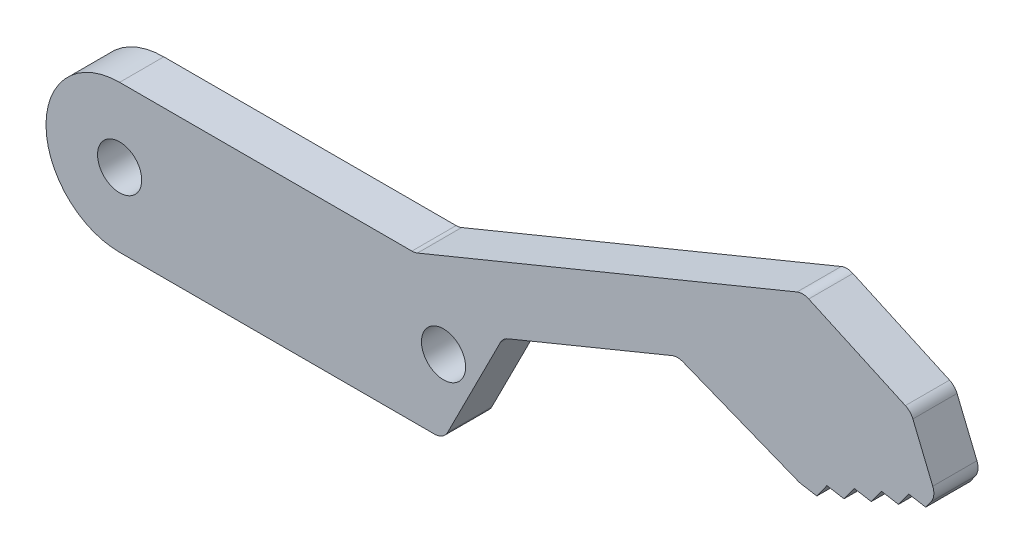
ISO-10303-21;
HEADER;
FILE_DESCRIPTION(('STEP AP214'),'2;1');
FILE_NAME('part.step','',(''),(''),'','','');
FILE_SCHEMA(('AUTOMOTIVE_DESIGN { 1 0 10303 214 1 1 1 1 }'));
ENDSEC;
DATA;
#1=APPLICATION_CONTEXT('core data for automotive mechanical design processes');
#2=APPLICATION_PROTOCOL_DEFINITION('international standard','automotive_design',2000,#1);
#3=PRODUCT_CONTEXT('',#1,'mechanical');
#4=PRODUCT('Part','Part','',(#3));
#5=PRODUCT_RELATED_PRODUCT_CATEGORY('part','',(#4));
#6=PRODUCT_DEFINITION_FORMATION('','',#4);
#7=PRODUCT_DEFINITION_CONTEXT('part definition',#1,'design');
#8=PRODUCT_DEFINITION('design','',#6,#7);
#9=PRODUCT_DEFINITION_SHAPE('','',#8);
#10=(LENGTH_UNIT() NAMED_UNIT(*) SI_UNIT(.MILLI.,.METRE.));
#11=(NAMED_UNIT(*) PLANE_ANGLE_UNIT() SI_UNIT($,.RADIAN.));
#12=(NAMED_UNIT(*) SI_UNIT($,.STERADIAN.) SOLID_ANGLE_UNIT());
#13=UNCERTAINTY_MEASURE_WITH_UNIT(LENGTH_MEASURE(1.E-05),#10,'distance_accuracy_value','');
#14=(GEOMETRIC_REPRESENTATION_CONTEXT(3) GLOBAL_UNCERTAINTY_ASSIGNED_CONTEXT((#13)) GLOBAL_UNIT_ASSIGNED_CONTEXT((#10,
#11,#12)) REPRESENTATION_CONTEXT('',''));
#15=CARTESIAN_POINT('',(0.,0.,0.));
#16=DIRECTION('',(0.,0.,1.));
#17=DIRECTION('',(1.,0.,0.));
#18=AXIS2_PLACEMENT_3D('',#15,#16,#17);
#19=CARTESIAN_POINT('',(-23.4985969391951,21.7748727167963,-4.8));
#20=DIRECTION('',(-0.167721751487341,-0.985834374567056,0.));
#21=DIRECTION('',(0.985834374567056,-0.167721751487341,0.));
#22=AXIS2_PLACEMENT_3D('',#19,#20,#21);
#23=PLANE('',#22);
#24=DIRECTION('',(0.985834374567056,-0.167721751487341,0.));
#25=VECTOR('',#24,1.);
#26=CARTESIAN_POINT('',(-23.4985969391951,21.7748727167963,1.8));
#27=LINE('',#26,#25);
#28=CARTESIAN_POINT('',(73.8339701157959,5.21551036914899,1.8));
#29=VERTEX_POINT('',#28);
#30=CARTESIAN_POINT('',(76.1637136117617,4.81914697409976,1.8));
#31=VERTEX_POINT('',#30);
#32=EDGE_CURVE('E299',#29,#31,#27,.T.);
#33=ORIENTED_EDGE('',*,*,#32,.F.);
#34=DIRECTION('',(0.,0.,1.));
#35=VECTOR('',#34,1.);
#36=CARTESIAN_POINT('',(73.8339701157959,5.21551036914899,-4.8));
#37=LINE('',#36,#35);
#38=CARTESIAN_POINT('',(73.8339701157959,5.21551036914899,-4.8));
#39=VERTEX_POINT('',#38);
#40=EDGE_CURVE('E225',#29,#39,#37,.F.);
#41=ORIENTED_EDGE('',*,*,#40,.T.);
#42=DIRECTION('',(0.985834374567056,-0.167721751487341,0.));
#43=VECTOR('',#42,1.);
#44=CARTESIAN_POINT('',(-23.4985969391951,21.7748727167963,-4.8));
#45=LINE('',#44,#43);
#46=CARTESIAN_POINT('',(76.1637136117617,4.81914697409976,-4.8));
#47=VERTEX_POINT('',#46);
#48=EDGE_CURVE('E219',#39,#47,#45,.T.);
#49=ORIENTED_EDGE('',*,*,#48,.T.);
#50=DIRECTION('',(0.,0.,1.));
#51=VECTOR('',#50,1.);
#52=CARTESIAN_POINT('',(76.1637136117617,4.81914697409976,-4.8));
#53=LINE('',#52,#51);
#54=EDGE_CURVE('E222',#47,#31,#53,.T.);
#55=ORIENTED_EDGE('',*,*,#54,.T.);
#56=EDGE_LOOP('',(#33,#41,#49,#55));
#57=FACE_BOUND('',#56,.T.);
#58=ADVANCED_FACE('F38',(#57),#23,.T.);
#59=CARTESIAN_POINT('',(-10.7524309757496,38.7393741326401,-4.8));
#60=DIRECTION('',(0.368935795459583,0.929454882621316,0.));
#61=DIRECTION('',(-0.929454882621316,0.368935795459583,0.));
#62=AXIS2_PLACEMENT_3D('',#59,#60,#61);
#63=PLANE('',#62);
#64=DIRECTION('',(-0.929454882621316,0.368935795459583,0.));
#65=VECTOR('',#64,1.);
#66=CARTESIAN_POINT('',(-10.7524309757496,38.7393741326401,-4.8));
#67=LINE('',#66,#65);
#68=CARTESIAN_POINT('',(73.3912992190569,5.33954525142962,-4.8));
#69=VERTEX_POINT('',#68);
#70=CARTESIAN_POINT('',(56.1655451294501,12.1770985380581,-4.8));
#71=VERTEX_POINT('',#70);
#72=EDGE_CURVE('E291',#69,#71,#67,.T.);
#73=ORIENTED_EDGE('',*,*,#72,.F.);
#74=DIRECTION('',(0.,0.,1.));
#75=VECTOR('',#74,1.);
#76=CARTESIAN_POINT('',(73.3912992190569,5.33954525142961,1.8));
#77=LINE('',#76,#75);
#78=CARTESIAN_POINT('',(73.3912992190569,5.33954525142962,1.8));
#79=VERTEX_POINT('',#78);
#80=EDGE_CURVE('E378',#69,#79,#77,.T.);
#81=ORIENTED_EDGE('',*,*,#80,.T.);
#82=DIRECTION('',(-0.929454882621316,0.368935795459583,0.));
#83=VECTOR('',#82,1.);
#84=CARTESIAN_POINT('',(-10.7524309757496,38.7393741326401,1.8));
#85=LINE('',#84,#83);
#86=CARTESIAN_POINT('',(56.1655451294501,12.1770985380581,1.8));
#87=VERTEX_POINT('',#86);
#88=EDGE_CURVE('E349',#79,#87,#85,.T.);
#89=ORIENTED_EDGE('',*,*,#88,.T.);
#90=DIRECTION('',(0.,0.,1.));
#91=VECTOR('',#90,1.);
#92=CARTESIAN_POINT('',(56.1655451294501,12.1770985380581,-4.8));
#93=LINE('',#92,#91);
#94=EDGE_CURVE('E359',#87,#71,#93,.F.);
#95=ORIENTED_EDGE('',*,*,#94,.T.);
#96=EDGE_LOOP('',(#73,#81,#89,#95));
#97=FACE_BOUND('',#96,.T.);
#98=ADVANCED_FACE('F536',(#97),#63,.F.);
#99=CARTESIAN_POINT('',(-22.0192492710195,-19.3009527520292,-4.8));
#100=DIRECTION('',(-0.380263412733206,0.924878228166549,0.));
#101=DIRECTION('',(-0.924878228166549,-0.380263412733206,0.));
#102=AXIS2_PLACEMENT_3D('',#99,#100,#101);
#103=PLANE('',#102);
#104=DIRECTION('',(-0.924878228166549,-0.380263412733206,0.));
#105=VECTOR('',#104,1.);
#106=CARTESIAN_POINT('',(-22.0192492710195,-19.3009527520292,-4.8));
#107=LINE('',#106,#105);
#108=CARTESIAN_POINT('',(54.517306871426,12.1670298982576,-4.8));
#109=VERTEX_POINT('',#108);
#110=CARTESIAN_POINT('',(30.0119702472426,2.09166791967512,-4.8));
#111=VERTEX_POINT('',#110);
#112=EDGE_CURVE('E288',#109,#111,#107,.T.);
#113=ORIENTED_EDGE('',*,*,#112,.F.);
#114=DIRECTION('',(0.,0.,1.));
#115=VECTOR('',#114,1.);
#116=CARTESIAN_POINT('',(54.517306871426,12.1670298982576,1.8));
#117=LINE('',#116,#115);
#118=CARTESIAN_POINT('',(54.517306871426,12.1670298982576,1.8));
#119=VERTEX_POINT('',#118);
#120=EDGE_CURVE('E422',#109,#119,#117,.T.);
#121=ORIENTED_EDGE('',*,*,#120,.T.);
#122=DIRECTION('',(-0.924878228166549,-0.380263412733206,0.));
#123=VECTOR('',#122,1.);
#124=CARTESIAN_POINT('',(-22.0192492710195,-19.3009527520292,1.8));
#125=LINE('',#124,#123);
#126=CARTESIAN_POINT('',(30.0119702472426,2.09166791967512,1.8));
#127=VERTEX_POINT('',#126);
#128=EDGE_CURVE('E346',#119,#127,#125,.T.);
#129=ORIENTED_EDGE('',*,*,#128,.T.);
#130=DIRECTION('',(0.,0.,1.));
#131=VECTOR('',#130,1.);
#132=CARTESIAN_POINT('',(30.0119702472426,2.09166791967511,-4.8));
#133=LINE('',#132,#131);
#134=EDGE_CURVE('E420',#127,#111,#133,.F.);
#135=ORIENTED_EDGE('',*,*,#134,.T.);
#136=EDGE_LOOP('',(#113,#121,#129,#135));
#137=FACE_BOUND('',#136,.T.);
#138=ADVANCED_FACE('F451',(#137),#103,.F.);
#139=CARTESIAN_POINT('',(14.9545934591534,-26.4767169371908,-4.8));
#140=DIRECTION('',(-0.892245156425912,0.451551304764474,0.));
#141=DIRECTION('',(-0.451551304764474,-0.892245156425912,0.));
#142=AXIS2_PLACEMENT_3D('',#139,#140,#141);
#143=PLANE('',#142);
#144=DIRECTION('',(-0.451551304764474,-0.892245156425912,0.));
#145=VECTOR('',#144,1.);
#146=CARTESIAN_POINT('',(14.9545934591534,-26.4767169371908,-4.8));
#147=LINE('',#146,#145);
#148=CARTESIAN_POINT('',(28.8856104111187,1.05034868819055,-4.8));
#149=VERTEX_POINT('',#148);
#150=CARTESIAN_POINT('',(21.0020805174896,-14.5271533340842,-4.8));
#151=VERTEX_POINT('',#150);
#152=EDGE_CURVE('E285',#149,#151,#147,.T.);
#153=ORIENTED_EDGE('',*,*,#152,.F.);
#154=DIRECTION('',(0.,0.,1.));
#155=VECTOR('',#154,1.);
#156=CARTESIAN_POINT('',(28.8856104111187,1.05034868819055,1.8));
#157=LINE('',#156,#155);
#158=CARTESIAN_POINT('',(28.8856104111187,1.05034868819055,1.8));
#159=VERTEX_POINT('',#158);
#160=EDGE_CURVE('E427',#149,#159,#157,.T.);
#161=ORIENTED_EDGE('',*,*,#160,.T.);
#162=DIRECTION('',(-0.451551304764474,-0.892245156425912,0.));
#163=VECTOR('',#162,1.);
#164=CARTESIAN_POINT('',(14.9545934591534,-26.4767169371908,1.8));
#165=LINE('',#164,#163);
#166=CARTESIAN_POINT('',(21.0020805174896,-14.5271533340842,1.8));
#167=VERTEX_POINT('',#166);
#168=EDGE_CURVE('E343',#159,#167,#165,.T.);
#169=ORIENTED_EDGE('',*,*,#168,.T.);
#170=DIRECTION('',(0.,0.,1.));
#171=VECTOR('',#170,1.);
#172=CARTESIAN_POINT('',(21.0020805174896,-14.5271533340842,-4.8));
#173=LINE('',#172,#171);
#174=EDGE_CURVE('E425',#167,#151,#173,.F.);
#175=ORIENTED_EDGE('',*,*,#174,.T.);
#176=EDGE_LOOP('',(#153,#161,#169,#175));
#177=FACE_BOUND('',#176,.T.);
#178=ADVANCED_FACE('F458',(#177),#143,.F.);
#179=CARTESIAN_POINT('',(-28.0085543385497,-15.7337404636024,-4.8));
#180=DIRECTION('',(0.,-1.,0.));
#181=DIRECTION('',(1.,0.,0.));
#182=AXIS2_PLACEMENT_3D('',#179,#180,#181);
#183=PLANE('',#182);
#184=DIRECTION('',(1.,0.,0.));
#185=VECTOR('',#184,1.);
#186=CARTESIAN_POINT('',(-28.0085543385497,-15.7337404636024,-4.8));
#187=LINE('',#186,#185);
#188=CARTESIAN_POINT('',(-28.0085543385497,-15.7337404636024,-4.8));
#189=VERTEX_POINT('',#188);
#190=CARTESIAN_POINT('',(19.0391411733526,-15.7337404636024,-4.8));
#191=VERTEX_POINT('',#190);
#192=EDGE_CURVE('E282',#189,#191,#187,.T.);
#193=ORIENTED_EDGE('',*,*,#192,.T.);
#194=DIRECTION('',(0.,0.,1.));
#195=VECTOR('',#194,1.);
#196=CARTESIAN_POINT('',(19.0391411733526,-15.7337404636024,1.8));
#197=LINE('',#196,#195);
#198=CARTESIAN_POINT('',(19.0391411733526,-15.7337404636024,1.8));
#199=VERTEX_POINT('',#198);
#200=EDGE_CURVE('E430',#191,#199,#197,.T.);
#201=ORIENTED_EDGE('',*,*,#200,.T.);
#202=DIRECTION('',(1.,0.,0.));
#203=VECTOR('',#202,1.);
#204=CARTESIAN_POINT('',(-28.0085543385497,-15.7337404636024,1.8));
#205=LINE('',#204,#203);
#206=CARTESIAN_POINT('',(-28.0085543385497,-15.7337404636024,1.8));
#207=VERTEX_POINT('',#206);
#208=EDGE_CURVE('E340',#207,#199,#205,.T.);
#209=ORIENTED_EDGE('',*,*,#208,.F.);
#210=DIRECTION('',(0.,0.,1.));
#211=VECTOR('',#210,1.);
#212=CARTESIAN_POINT('',(-28.0085543385497,-15.7337404636024,-4.8));
#213=LINE('',#212,#211);
#214=EDGE_CURVE('E357',#189,#207,#213,.T.);
#215=ORIENTED_EDGE('',*,*,#214,.F.);
#216=EDGE_LOOP('',(#193,#201,#209,#215));
#217=FACE_BOUND('',#216,.T.);
#218=ADVANCED_FACE('F465',(#217),#183,.T.);
#219=CARTESIAN_POINT('',(-28.0085543385497,-4.7337404636024,-4.8));
#220=DIRECTION('',(0.,0.,1.));
#221=DIRECTION('',(1.,0.,0.));
#222=AXIS2_PLACEMENT_3D('',#219,#220,#221);
#223=CYLINDRICAL_SURFACE('',#222,11.);
#224=CARTESIAN_POINT('',(-28.0085543385497,-4.7337404636024,1.8));
#225=DIRECTION('',(0.,0.,1.));
#226=DIRECTION('',(1.,0.,0.));
#227=AXIS2_PLACEMENT_3D('',#224,#225,#226);
#228=CIRCLE('',#227,11.);
#229=CARTESIAN_POINT('',(-28.0085543385497,6.2662595363976,1.8));
#230=VERTEX_POINT('',#229);
#231=EDGE_CURVE('E337',#230,#207,#228,.T.);
#232=ORIENTED_EDGE('',*,*,#231,.F.);
#233=DIRECTION('',(0.,0.,1.));
#234=VECTOR('',#233,1.);
#235=CARTESIAN_POINT('',(-28.0085543385497,6.2662595363976,-4.8));
#236=LINE('',#235,#234);
#237=CARTESIAN_POINT('',(-28.0085543385497,6.2662595363976,-4.8));
#238=VERTEX_POINT('',#237);
#239=EDGE_CURVE('E360',#238,#230,#236,.T.);
#240=ORIENTED_EDGE('',*,*,#239,.F.);
#241=CARTESIAN_POINT('',(-28.0085543385497,-4.7337404636024,-4.8));
#242=DIRECTION('',(0.,0.,1.));
#243=DIRECTION('',(1.,0.,0.));
#244=AXIS2_PLACEMENT_3D('',#241,#242,#243);
#245=CIRCLE('',#244,11.);
#246=EDGE_CURVE('E279',#238,#189,#245,.T.);
#247=ORIENTED_EDGE('',*,*,#246,.T.);
#248=ORIENTED_EDGE('',*,*,#214,.T.);
#249=EDGE_LOOP('',(#232,#240,#247,#248));
#250=FACE_BOUND('',#249,.T.);
#251=ADVANCED_FACE('F469',(#250),#223,.T.);
#252=CARTESIAN_POINT('',(-28.0085543385497,6.2662595363976,-4.8));
#253=DIRECTION('',(0.,-1.,0.));
#254=DIRECTION('',(1.,0.,0.));
#255=AXIS2_PLACEMENT_3D('',#252,#253,#254);
#256=PLANE('',#255);
#257=DIRECTION('',(1.,0.,0.));
#258=VECTOR('',#257,1.);
#259=CARTESIAN_POINT('',(-28.0085543385497,6.2662595363976,1.8));
#260=LINE('',#259,#258);
#261=CARTESIAN_POINT('',(15.6668314111712,6.26625953639759,1.8));
#262=VERTEX_POINT('',#261);
#263=EDGE_CURVE('E334',#230,#262,#260,.T.);
#264=ORIENTED_EDGE('',*,*,#263,.T.);
#265=DIRECTION('',(0.,0.,1.));
#266=VECTOR('',#265,1.);
#267=CARTESIAN_POINT('',(15.6668314111712,6.26625953639759,-4.8));
#268=LINE('',#267,#266);
#269=CARTESIAN_POINT('',(15.6668314111712,6.26625953639759,-4.8));
#270=VERTEX_POINT('',#269);
#271=EDGE_CURVE('E418',#262,#270,#268,.F.);
#272=ORIENTED_EDGE('',*,*,#271,.T.);
#273=DIRECTION('',(1.,0.,0.));
#274=VECTOR('',#273,1.);
#275=CARTESIAN_POINT('',(-28.0085543385497,6.2662595363976,-4.8));
#276=LINE('',#275,#274);
#277=EDGE_CURVE('E276',#238,#270,#276,.T.);
#278=ORIENTED_EDGE('',*,*,#277,.F.);
#279=ORIENTED_EDGE('',*,*,#239,.T.);
#280=EDGE_LOOP('',(#264,#272,#278,#279));
#281=FACE_BOUND('',#280,.T.);
#282=ADVANCED_FACE('F742',(#281),#256,.F.);
#283=CARTESIAN_POINT('',(-25.4989076002763,-10.8377135277866,-4.8));
#284=DIRECTION('',(0.380263412733206,-0.924878228166549,0.));
#285=DIRECTION('',(0.924878228166549,0.380263412733206,0.));
#286=AXIS2_PLACEMENT_3D('',#283,#284,#285);
#287=PLANE('',#286);
#288=DIRECTION('',(0.924878228166549,0.380263412733206,0.));
#289=VECTOR('',#288,1.);
#290=CARTESIAN_POINT('',(-25.4989076002763,-10.8377135277866,1.8));
#291=LINE('',#290,#289);
#292=CARTESIAN_POINT('',(16.5034109191842,6.43152743443118,1.8));
#293=VERTEX_POINT('',#292);
#294=CARTESIAN_POINT('',(73.209976115322,29.7464151127887,1.8));
#295=VERTEX_POINT('',#294);
#296=EDGE_CURVE('E331',#293,#295,#291,.T.);
#297=ORIENTED_EDGE('',*,*,#296,.T.);
#298=DIRECTION('',(0.,0.,1.));
#299=VECTOR('',#298,1.);
#300=CARTESIAN_POINT('',(73.209976115322,29.7464151127887,-4.8));
#301=LINE('',#300,#299);
#302=CARTESIAN_POINT('',(73.209976115322,29.7464151127887,-4.8));
#303=VERTEX_POINT('',#302);
#304=EDGE_CURVE('E416',#295,#303,#301,.F.);
#305=ORIENTED_EDGE('',*,*,#304,.T.);
#306=DIRECTION('',(0.924878228166549,0.380263412733206,0.));
#307=VECTOR('',#306,1.);
#308=CARTESIAN_POINT('',(-25.4989076002763,-10.8377135277866,-4.8));
#309=LINE('',#308,#307);
#310=CARTESIAN_POINT('',(16.5034109191842,6.43152743443118,-4.8));
#311=VERTEX_POINT('',#310);
#312=EDGE_CURVE('E273',#311,#303,#309,.T.);
#313=ORIENTED_EDGE('',*,*,#312,.F.);
#314=DIRECTION('',(0.,0.,1.));
#315=VECTOR('',#314,1.);
#316=CARTESIAN_POINT('',(16.5034109191842,6.43152743443118,1.8));
#317=LINE('',#316,#315);
#318=EDGE_CURVE('E413',#311,#293,#317,.T.);
#319=ORIENTED_EDGE('',*,*,#318,.T.);
#320=EDGE_LOOP('',(#297,#305,#313,#319));
#321=FACE_BOUND('',#320,.T.);
#322=ADVANCED_FACE('F480',(#321),#287,.F.);
#323=CARTESIAN_POINT('',(2.67882750053871,62.6371157810134,-4.8));
#324=DIRECTION('',(-0.414522259932088,-0.910039172794663,0.));
#325=DIRECTION('',(0.910039172794663,-0.414522259932088,0.));
#326=AXIS2_PLACEMENT_3D('',#323,#324,#325);
#327=PLANE('',#326);
#328=DIRECTION('',(0.910039172794663,-0.414522259932088,0.));
#329=VECTOR('',#328,1.);
#330=CARTESIAN_POINT('',(2.67882750053871,62.6371157810134,1.8));
#331=LINE('',#330,#329);
#332=CARTESIAN_POINT('',(74.9585045951857,29.7137691909705,1.8));
#333=VERTEX_POINT('',#332);
#334=CARTESIAN_POINT('',(89.3969433906142,23.1370695737524,1.8));
#335=VERTEX_POINT('',#334);
#336=EDGE_CURVE('E328',#333,#335,#331,.T.);
#337=ORIENTED_EDGE('',*,*,#336,.T.);
#338=DIRECTION('',(0.,0.,1.));
#339=VECTOR('',#338,1.);
#340=CARTESIAN_POINT('',(89.3969433906142,23.1370695737524,-4.8));
#341=LINE('',#340,#339);
#342=CARTESIAN_POINT('',(89.3969433906142,23.1370695737524,-4.8));
#343=VERTEX_POINT('',#342);
#344=EDGE_CURVE('E411',#335,#343,#341,.F.);
#345=ORIENTED_EDGE('',*,*,#344,.T.);
#346=DIRECTION('',(0.910039172794663,-0.414522259932088,0.));
#347=VECTOR('',#346,1.);
#348=CARTESIAN_POINT('',(2.67882750053871,62.6371157810134,-4.8));
#349=LINE('',#348,#347);
#350=CARTESIAN_POINT('',(74.9585045951857,29.7137691909705,-4.8));
#351=VERTEX_POINT('',#350);
#352=EDGE_CURVE('E270',#351,#343,#349,.T.);
#353=ORIENTED_EDGE('',*,*,#352,.F.);
#354=DIRECTION('',(0.,0.,1.));
#355=VECTOR('',#354,1.);
#356=CARTESIAN_POINT('',(74.9585045951857,29.7137691909705,-4.8));
#357=LINE('',#356,#355);
#358=EDGE_CURVE('E408',#351,#333,#357,.T.);
#359=ORIENTED_EDGE('',*,*,#358,.T.);
#360=EDGE_LOOP('',(#337,#345,#353,#359));
#361=FACE_BOUND('',#360,.T.);
#362=ADVANCED_FACE('F490',(#361),#327,.F.);
#363=CARTESIAN_POINT('',(82.7726903900345,40.8139358730261,-4.8));
#364=DIRECTION('',(-0.924878228166548,-0.38026341273321,0.));
#365=DIRECTION('',(0.38026341273321,-0.924878228166548,0.));
#366=AXIS2_PLACEMENT_3D('',#363,#364,#365);
#367=PLANE('',#366);
#368=DIRECTION('',(0.38026341273321,-0.924878228166548,0.));
#369=VECTOR('',#368,1.);
#370=CARTESIAN_POINT('',(82.7726903900345,40.8139358730261,1.8));
#371=LINE('',#370,#369);
#372=CARTESIAN_POINT('',(90.51972652073,21.9715629016172,1.8));
#373=VERTEX_POINT('',#372);
#374=CARTESIAN_POINT('',(93.4897681177018,14.7478155785599,1.8));
#375=VERTEX_POINT('',#374);
#376=EDGE_CURVE('E326',#373,#375,#371,.T.);
#377=ORIENTED_EDGE('',*,*,#376,.T.);
#378=DIRECTION('',(0.,0.,1.));
#379=VECTOR('',#378,1.);
#380=CARTESIAN_POINT('',(93.4897681177018,14.7478155785599,-4.8));
#381=LINE('',#380,#379);
#382=CARTESIAN_POINT('',(93.4897681177018,14.7478155785599,-4.8));
#383=VERTEX_POINT('',#382);
#384=EDGE_CURVE('E61',#375,#383,#381,.F.);
#385=ORIENTED_EDGE('',*,*,#384,.T.);
#386=DIRECTION('',(0.38026341273321,-0.924878228166548,0.));
#387=VECTOR('',#386,1.);
#388=CARTESIAN_POINT('',(82.7726903900345,40.8139358730261,-4.8));
#389=LINE('',#388,#387);
#390=CARTESIAN_POINT('',(90.51972652073,21.9715629016172,-4.8));
#391=VERTEX_POINT('',#390);
#392=EDGE_CURVE('E268',#391,#383,#389,.T.);
#393=ORIENTED_EDGE('',*,*,#392,.F.);
#394=DIRECTION('',(0.,0.,1.));
#395=VECTOR('',#394,1.);
#396=CARTESIAN_POINT('',(90.51972652073,21.9715629016172,-4.8));
#397=LINE('',#396,#395);
#398=EDGE_CURVE('E404',#391,#373,#397,.T.);
#399=ORIENTED_EDGE('',*,*,#398,.T.);
#400=EDGE_LOOP('',(#377,#385,#393,#399));
#401=FACE_BOUND('',#400,.T.);
#402=ADVANCED_FACE('F497',(#401),#367,.F.);
#403=CARTESIAN_POINT('',(43.8426905918468,-56.258856100548,-4.8));
#404=DIRECTION('',(0.812647209633221,-0.582755963225894,0.));
#405=DIRECTION('',(0.582755963225894,0.812647209633221,0.));
#406=AXIS2_PLACEMENT_3D('',#403,#404,#405);
#407=PLANE('',#406);
#408=DIRECTION('',(0.582755963225894,0.812647209633221,0.));
#409=VECTOR('',#408,1.);
#410=CARTESIAN_POINT('',(43.8426905918468,-56.258856100548,-4.8));
#411=LINE('',#410,#409);
#412=CARTESIAN_POINT('',(92.4415704274929,11.5117830382042,-4.8));
#413=VERTEX_POINT('',#412);
#414=CARTESIAN_POINT('',(93.2428598769284,12.6291729514498,-4.8));
#415=VERTEX_POINT('',#414);
#416=EDGE_CURVE('E266',#413,#415,#411,.T.);
#417=ORIENTED_EDGE('',*,*,#416,.T.);
#418=DIRECTION('',(0.,0.,1.));
#419=VECTOR('',#418,1.);
#420=CARTESIAN_POINT('',(93.2428598769284,12.6291729514498,1.8));
#421=LINE('',#420,#419);
#422=CARTESIAN_POINT('',(93.2428598769284,12.6291729514498,1.8));
#423=VERTEX_POINT('',#422);
#424=EDGE_CURVE('E401',#415,#423,#421,.T.);
#425=ORIENTED_EDGE('',*,*,#424,.T.);
#426=DIRECTION('',(0.582755963225894,0.812647209633221,0.));
#427=VECTOR('',#426,1.);
#428=CARTESIAN_POINT('',(43.8426905918468,-56.258856100548,1.8));
#429=LINE('',#428,#427);
#430=CARTESIAN_POINT('',(92.4415704274929,11.5117830382042,1.8));
#431=VERTEX_POINT('',#430);
#432=EDGE_CURVE('E323',#431,#423,#429,.T.);
#433=ORIENTED_EDGE('',*,*,#432,.F.);
#434=DIRECTION('',(0.,0.,1.));
#435=VECTOR('',#434,1.);
#436=CARTESIAN_POINT('',(92.4415704274929,11.5117830382042,-4.8));
#437=LINE('',#436,#435);
#438=EDGE_CURVE('E362',#413,#431,#437,.T.);
#439=ORIENTED_EDGE('',*,*,#438,.F.);
#440=EDGE_LOOP('',(#417,#425,#433,#439));
#441=FACE_BOUND('',#440,.T.);
#442=ADVANCED_FACE('F503',(#441),#407,.T.);
#443=CARTESIAN_POINT('',(-21.9340915703288,30.9707173710868,-4.8));
#444=DIRECTION('',(-0.167721751487341,-0.985834374567056,0.));
#445=DIRECTION('',(0.985834374567056,-0.167721751487341,0.));
#446=AXIS2_PLACEMENT_3D('',#443,#444,#445);
#447=PLANE('',#446);
#448=DIRECTION('',(0.985834374567056,-0.167721751487341,0.));
#449=VECTOR('',#448,1.);
#450=CARTESIAN_POINT('',(-21.9340915703288,30.9707173710868,1.8));
#451=LINE('',#450,#449);
#452=CARTESIAN_POINT('',(89.8839761330183,11.9469110939201,1.8));
#453=VERTEX_POINT('',#452);
#454=EDGE_CURVE('E320',#453,#431,#451,.T.);
#455=ORIENTED_EDGE('',*,*,#454,.F.);
#456=DIRECTION('',(0.,0.,1.));
#457=VECTOR('',#456,1.);
#458=CARTESIAN_POINT('',(89.8839761330183,11.9469110939201,-4.8));
#459=LINE('',#458,#457);
#460=CARTESIAN_POINT('',(89.8839761330183,11.9469110939201,-4.8));
#461=VERTEX_POINT('',#460);
#462=EDGE_CURVE('E364',#461,#453,#459,.T.);
#463=ORIENTED_EDGE('',*,*,#462,.F.);
#464=DIRECTION('',(0.985834374567056,-0.167721751487341,0.));
#465=VECTOR('',#464,1.);
#466=CARTESIAN_POINT('',(-21.9340915703288,30.9707173710868,-4.8));
#467=LINE('',#466,#465);
#468=EDGE_CURVE('E263',#461,#413,#467,.T.);
#469=ORIENTED_EDGE('',*,*,#468,.T.);
#470=ORIENTED_EDGE('',*,*,#438,.T.);
#471=EDGE_LOOP('',(#455,#463,#469,#470));
#472=FACE_BOUND('',#471,.T.);
#473=ADVANCED_FACE('F508',(#472),#447,.T.);
#474=CARTESIAN_POINT('',(41.9476010891602,-54.8998719122703,-4.8));
#475=DIRECTION('',(0.812647209633235,-0.582755963225875,0.));
#476=DIRECTION('',(0.582755963225875,0.812647209633235,0.));
#477=AXIS2_PLACEMENT_3D('',#474,#475,#476);
#478=PLANE('',#477);
#479=DIRECTION('',(0.582755963225875,0.812647209633235,0.));
#480=VECTOR('',#479,1.);
#481=CARTESIAN_POINT('',(41.9476010891602,-54.8998719122703,1.8));
#482=LINE('',#481,#480);
#483=CARTESIAN_POINT('',(88.3721062235601,9.83862402217813,1.8));
#484=VERTEX_POINT('',#483);
#485=EDGE_CURVE('E317',#484,#453,#482,.T.);
#486=ORIENTED_EDGE('',*,*,#485,.F.);
#487=DIRECTION('',(0.,0.,1.));
#488=VECTOR('',#487,1.);
#489=CARTESIAN_POINT('',(88.3721062235601,9.83862402217813,-4.8));
#490=LINE('',#489,#488);
#491=CARTESIAN_POINT('',(88.3721062235601,9.83862402217813,-4.8));
#492=VERTEX_POINT('',#491);
#493=EDGE_CURVE('E366',#492,#484,#490,.T.);
#494=ORIENTED_EDGE('',*,*,#493,.F.);
#495=DIRECTION('',(0.582755963225875,0.812647209633235,0.));
#496=VECTOR('',#495,1.);
#497=CARTESIAN_POINT('',(41.9476010891602,-54.8998719122703,-4.8));
#498=LINE('',#497,#496);
#499=EDGE_CURVE('E260',#492,#461,#498,.T.);
#500=ORIENTED_EDGE('',*,*,#499,.T.);
#501=ORIENTED_EDGE('',*,*,#462,.T.);
#502=EDGE_LOOP('',(#486,#494,#500,#501));
#503=FACE_BOUND('',#502,.T.);
#504=ADVANCED_FACE('F511',(#503),#478,.T.);
#505=CARTESIAN_POINT('',(-22.3252179125456,28.6717562075136,-4.8));
#506=DIRECTION('',(-0.167721751487335,-0.985834374567057,0.));
#507=DIRECTION('',(0.985834374567057,-0.167721751487336,0.));
#508=AXIS2_PLACEMENT_3D('',#505,#506,#507);
#509=PLANE('',#508);
#510=DIRECTION('',(0.985834374567057,-0.167721751487336,0.));
#511=VECTOR('',#510,1.);
#512=CARTESIAN_POINT('',(-22.3252179125456,28.6717562075136,1.8));
#513=LINE('',#512,#511);
#514=CARTESIAN_POINT('',(85.8145119290856,10.273752077894,1.8));
#515=VERTEX_POINT('',#514);
#516=EDGE_CURVE('E314',#515,#484,#513,.T.);
#517=ORIENTED_EDGE('',*,*,#516,.F.);
#518=DIRECTION('',(0.,0.,1.));
#519=VECTOR('',#518,1.);
#520=CARTESIAN_POINT('',(85.8145119290856,10.273752077894,-4.8));
#521=LINE('',#520,#519);
#522=CARTESIAN_POINT('',(85.8145119290856,10.273752077894,-4.8));
#523=VERTEX_POINT('',#522);
#524=EDGE_CURVE('E368',#523,#515,#521,.T.);
#525=ORIENTED_EDGE('',*,*,#524,.F.);
#526=DIRECTION('',(0.985834374567057,-0.167721751487336,0.));
#527=VECTOR('',#526,1.);
#528=CARTESIAN_POINT('',(-22.3252179125456,28.6717562075136,-4.8));
#529=LINE('',#528,#527);
#530=EDGE_CURVE('E257',#523,#492,#529,.T.);
#531=ORIENTED_EDGE('',*,*,#530,.T.);
#532=ORIENTED_EDGE('',*,*,#493,.T.);
#533=EDGE_LOOP('',(#517,#525,#531,#532));
#534=FACE_BOUND('',#533,.T.);
#535=ADVANCED_FACE('F516',(#534),#509,.T.);
#536=CARTESIAN_POINT('',(40.0525115864701,-53.5408877239934,-4.8));
#537=DIRECTION('',(0.812647209633232,-0.582755963225879,0.));
#538=DIRECTION('',(0.582755963225879,0.812647209633232,0.));
#539=AXIS2_PLACEMENT_3D('',#536,#537,#538);
#540=PLANE('',#539);
#541=DIRECTION('',(0.582755963225879,0.812647209633232,0.));
#542=VECTOR('',#541,1.);
#543=CARTESIAN_POINT('',(40.0525115864701,-53.5408877239934,1.8));
#544=LINE('',#543,#542);
#545=CARTESIAN_POINT('',(84.3026420196273,8.16546500615194,1.8));
#546=VERTEX_POINT('',#545);
#547=EDGE_CURVE('E311',#546,#515,#544,.T.);
#548=ORIENTED_EDGE('',*,*,#547,.F.);
#549=DIRECTION('',(0.,0.,1.));
#550=VECTOR('',#549,1.);
#551=CARTESIAN_POINT('',(84.3026420196273,8.16546500615194,-4.8));
#552=LINE('',#551,#550);
#553=CARTESIAN_POINT('',(84.3026420196273,8.16546500615194,-4.8));
#554=VERTEX_POINT('',#553);
#555=EDGE_CURVE('E370',#554,#546,#552,.T.);
#556=ORIENTED_EDGE('',*,*,#555,.F.);
#557=DIRECTION('',(0.582755963225879,0.812647209633232,0.));
#558=VECTOR('',#557,1.);
#559=CARTESIAN_POINT('',(40.0525115864701,-53.5408877239934,-4.8));
#560=LINE('',#559,#558);
#561=EDGE_CURVE('E254',#554,#523,#560,.T.);
#562=ORIENTED_EDGE('',*,*,#561,.T.);
#563=ORIENTED_EDGE('',*,*,#524,.T.);
#564=EDGE_LOOP('',(#548,#556,#562,#563));
#565=FACE_BOUND('',#564,.T.);
#566=ADVANCED_FACE('F519',(#565),#540,.T.);
#567=CARTESIAN_POINT('',(-22.7163442547615,26.3727950439424,-4.8));
#568=DIRECTION('',(-0.16772175148735,-0.985834374567054,0.));
#569=DIRECTION('',(0.985834374567055,-0.16772175148735,0.));
#570=AXIS2_PLACEMENT_3D('',#567,#568,#569);
#571=PLANE('',#570);
#572=DIRECTION('',(0.985834374567055,-0.16772175148735,0.));
#573=VECTOR('',#572,1.);
#574=CARTESIAN_POINT('',(-22.7163442547615,26.3727950439424,1.8));
#575=LINE('',#574,#573);
#576=CARTESIAN_POINT('',(81.7450477251527,8.6005930618679,1.8));
#577=VERTEX_POINT('',#576);
#578=EDGE_CURVE('E308',#577,#546,#575,.T.);
#579=ORIENTED_EDGE('',*,*,#578,.F.);
#580=DIRECTION('',(0.,0.,1.));
#581=VECTOR('',#580,1.);
#582=CARTESIAN_POINT('',(81.7450477251527,8.6005930618679,-4.8));
#583=LINE('',#582,#581);
#584=CARTESIAN_POINT('',(81.7450477251527,8.6005930618679,-4.8));
#585=VERTEX_POINT('',#584);
#586=EDGE_CURVE('E372',#585,#577,#583,.T.);
#587=ORIENTED_EDGE('',*,*,#586,.F.);
#588=DIRECTION('',(0.985834374567055,-0.16772175148735,0.));
#589=VECTOR('',#588,1.);
#590=CARTESIAN_POINT('',(-22.7163442547615,26.3727950439424,-4.8));
#591=LINE('',#590,#589);
#592=EDGE_CURVE('E251',#585,#554,#591,.T.);
#593=ORIENTED_EDGE('',*,*,#592,.T.);
#594=ORIENTED_EDGE('',*,*,#555,.T.);
#595=EDGE_LOOP('',(#579,#587,#593,#594));
#596=FACE_BOUND('',#595,.T.);
#597=ADVANCED_FACE('F523',(#596),#571,.T.);
#598=CARTESIAN_POINT('',(38.1574220837817,-52.1819035357161,-4.8));
#599=DIRECTION('',(0.812647209633238,-0.582755963225871,0.));
#600=DIRECTION('',(0.582755963225871,0.812647209633238,0.));
#601=AXIS2_PLACEMENT_3D('',#598,#599,#600);
#602=PLANE('',#601);
#603=DIRECTION('',(0.582755963225871,0.812647209633238,0.));
#604=VECTOR('',#603,1.);
#605=CARTESIAN_POINT('',(38.1574220837817,-52.1819035357161,1.8));
#606=LINE('',#605,#604);
#607=CARTESIAN_POINT('',(80.2331778156945,6.49230599012585,1.8));
#608=VERTEX_POINT('',#607);
#609=EDGE_CURVE('E305',#608,#577,#606,.T.);
#610=ORIENTED_EDGE('',*,*,#609,.F.);
#611=DIRECTION('',(0.,0.,1.));
#612=VECTOR('',#611,1.);
#613=CARTESIAN_POINT('',(80.2331778156945,6.49230599012585,-4.8));
#614=LINE('',#613,#612);
#615=CARTESIAN_POINT('',(80.2331778156945,6.49230599012585,-4.8));
#616=VERTEX_POINT('',#615);
#617=EDGE_CURVE('E374',#616,#608,#614,.T.);
#618=ORIENTED_EDGE('',*,*,#617,.F.);
#619=DIRECTION('',(0.582755963225871,0.812647209633238,0.));
#620=VECTOR('',#619,1.);
#621=CARTESIAN_POINT('',(38.1574220837817,-52.1819035357161,-4.8));
#622=LINE('',#621,#620);
#623=EDGE_CURVE('E246',#616,#585,#622,.T.);
#624=ORIENTED_EDGE('',*,*,#623,.T.);
#625=ORIENTED_EDGE('',*,*,#586,.T.);
#626=EDGE_LOOP('',(#610,#618,#624,#625));
#627=FACE_BOUND('',#626,.T.);
#628=ADVANCED_FACE('F526',(#627),#602,.T.);
#629=CARTESIAN_POINT('',(-23.1074705969782,24.0738338803695,-4.8));
#630=DIRECTION('',(-0.167721751487347,-0.985834374567055,0.));
#631=DIRECTION('',(0.985834374567055,-0.167721751487347,0.));
#632=AXIS2_PLACEMENT_3D('',#629,#630,#631);
#633=PLANE('',#632);
#634=DIRECTION('',(0.985834374567055,-0.167721751487347,0.));
#635=VECTOR('',#634,1.);
#636=CARTESIAN_POINT('',(-23.1074705969782,24.0738338803695,1.8));
#637=LINE('',#636,#635);
#638=CARTESIAN_POINT('',(77.6755835212199,6.92743404584181,1.8));
#639=VERTEX_POINT('',#638);
#640=EDGE_CURVE('E302',#639,#608,#637,.T.);
#641=ORIENTED_EDGE('',*,*,#640,.F.);
#642=DIRECTION('',(0.,0.,1.));
#643=VECTOR('',#642,1.);
#644=CARTESIAN_POINT('',(77.6755835212199,6.92743404584181,-4.8));
#645=LINE('',#644,#643);
#646=CARTESIAN_POINT('',(77.6755835212199,6.92743404584181,-4.8));
#647=VERTEX_POINT('',#646);
#648=EDGE_CURVE('E236',#647,#639,#645,.T.);
#649=ORIENTED_EDGE('',*,*,#648,.F.);
#650=DIRECTION('',(0.985834374567055,-0.167721751487347,0.));
#651=VECTOR('',#650,1.);
#652=CARTESIAN_POINT('',(-23.1074705969782,24.0738338803695,-4.8));
#653=LINE('',#652,#651);
#654=EDGE_CURVE('E244',#647,#616,#653,.T.);
#655=ORIENTED_EDGE('',*,*,#654,.T.);
#656=ORIENTED_EDGE('',*,*,#617,.T.);
#657=EDGE_LOOP('',(#641,#649,#655,#656));
#658=FACE_BOUND('',#657,.T.);
#659=ADVANCED_FACE('F529',(#658),#633,.T.);
#660=CARTESIAN_POINT('',(20.3914456614503,-4.73374046360239,-4.8));
#661=DIRECTION('',(0.,0.,1.));
#662=DIRECTION('',(1.,0.,0.));
#663=AXIS2_PLACEMENT_3D('',#660,#661,#662);
#664=CYLINDRICAL_SURFACE('',#663,3.30000000000001);
#665=CARTESIAN_POINT('',(20.3914456614503,-4.73374046360239,-4.8));
#666=DIRECTION('',(0.,0.,1.));
#667=DIRECTION('',(1.,0.,0.));
#668=AXIS2_PLACEMENT_3D('',#665,#666,#667);
#669=CIRCLE('',#668,3.30000000000001);
#670=CARTESIAN_POINT('',(23.6914456614503,-4.73374046360239,-4.8));
#671=VERTEX_POINT('',#670);
#672=EDGE_CURVE('E294',#671,#671,#669,.T.);
#673=ORIENTED_EDGE('',*,*,#672,.F.);
#674=EDGE_LOOP('',(#673));
#675=FACE_BOUND('',#674,.T.);
#676=CARTESIAN_POINT('',(20.3914456614503,-4.73374046360239,1.8));
#677=DIRECTION('',(0.,0.,1.));
#678=DIRECTION('',(1.,0.,0.));
#679=AXIS2_PLACEMENT_3D('',#676,#677,#678);
#680=CIRCLE('',#679,3.30000000000001);
#681=CARTESIAN_POINT('',(23.6914456614503,-4.73374046360239,1.8));
#682=VERTEX_POINT('',#681);
#683=EDGE_CURVE('E352',#682,#682,#680,.T.);
#684=ORIENTED_EDGE('',*,*,#683,.T.);
#685=EDGE_LOOP('',(#684));
#686=FACE_BOUND('',#685,.T.);
#687=ADVANCED_FACE('F646',(#675,#686),#664,.F.);
#688=CARTESIAN_POINT('',(36.2623325810918,-50.8229193474391,-4.8));
#689=DIRECTION('',(0.812647209633236,-0.582755963225874,0.));
#690=DIRECTION('',(0.582755963225874,0.812647209633236,0.));
#691=AXIS2_PLACEMENT_3D('',#688,#689,#690);
#692=PLANE('',#691);
#693=DIRECTION('',(0.582755963225874,0.812647209633236,0.));
#694=VECTOR('',#693,1.);
#695=CARTESIAN_POINT('',(36.2623325810918,-50.8229193474391,1.8));
#696=LINE('',#695,#694);
#697=EDGE_CURVE('E235',#31,#639,#696,.T.);
#698=ORIENTED_EDGE('',*,*,#697,.F.);
#699=ORIENTED_EDGE('',*,*,#54,.F.);
#700=DIRECTION('',(0.582755963225874,0.812647209633236,0.));
#701=VECTOR('',#700,1.);
#702=CARTESIAN_POINT('',(36.2623325810918,-50.8229193474391,-4.8));
#703=LINE('',#702,#701);
#704=EDGE_CURVE('E228',#47,#647,#703,.T.);
#705=ORIENTED_EDGE('',*,*,#704,.T.);
#706=ORIENTED_EDGE('',*,*,#648,.T.);
#707=EDGE_LOOP('',(#698,#699,#705,#706));
#708=FACE_BOUND('',#707,.T.);
#709=ADVANCED_FACE('F233',(#708),#692,.T.);
#710=CARTESIAN_POINT('',(-28.0085543385497,-4.7337404636024,-4.8));
#711=DIRECTION('',(0.,0.,1.));
#712=DIRECTION('',(1.,0.,0.));
#713=AXIS2_PLACEMENT_3D('',#710,#711,#712);
#714=CYLINDRICAL_SURFACE('',#713,3.3);
#715=CARTESIAN_POINT('',(-28.0085543385497,-4.7337404636024,-4.8));
#716=DIRECTION('',(0.,0.,1.));
#717=DIRECTION('',(1.,0.,0.));
#718=AXIS2_PLACEMENT_3D('',#715,#716,#717);
#719=CIRCLE('',#718,3.3);
#720=CARTESIAN_POINT('',(-24.7085543385497,-4.7337404636024,-4.8));
#721=VERTEX_POINT('',#720);
#722=EDGE_CURVE('E237',#721,#721,#719,.T.);
#723=ORIENTED_EDGE('',*,*,#722,.F.);
#724=EDGE_LOOP('',(#723));
#725=FACE_BOUND('',#724,.T.);
#726=CARTESIAN_POINT('',(-28.0085543385497,-4.7337404636024,1.8));
#727=DIRECTION('',(0.,0.,1.));
#728=DIRECTION('',(1.,0.,0.));
#729=AXIS2_PLACEMENT_3D('',#726,#727,#728);
#730=CIRCLE('',#729,3.3);
#731=CARTESIAN_POINT('',(-24.7085543385497,-4.7337404636024,1.8));
#732=VERTEX_POINT('',#731);
#733=EDGE_CURVE('E229',#732,#732,#730,.T.);
#734=ORIENTED_EDGE('',*,*,#733,.T.);
#735=EDGE_LOOP('',(#734));
#736=FACE_BOUND('',#735,.T.);
#737=ADVANCED_FACE('F625',(#725,#736),#714,.F.);
#738=CARTESIAN_POINT('',(-28.0085543385497,-4.7337404636024,-4.8));
#739=DIRECTION('',(0.,0.,1.));
#740=DIRECTION('',(1.,0.,0.));
#741=AXIS2_PLACEMENT_3D('',#738,#739,#740);
#742=PLANE('',#741);
#743=ORIENTED_EDGE('',*,*,#48,.F.);
#744=CARTESIAN_POINT('',(74.202957969068,7.38434599319651,-4.8));
#745=DIRECTION('',(0.,0.,1.));
#746=DIRECTION('',(1.,0.,0.));
#747=AXIS2_PLACEMENT_3D('',#744,#745,#746);
#748=CIRCLE('',#747,2.2);
#749=EDGE_CURVE('E399',#39,#69,#748,.F.);
#750=ORIENTED_EDGE('',*,*,#749,.T.);
#751=ORIENTED_EDGE('',*,*,#72,.T.);
#752=CARTESIAN_POINT('',(55.353886379439,10.1322977962912,-4.8));
#753=DIRECTION('',(0.,0.,1.));
#754=DIRECTION('',(1.,0.,0.));
#755=AXIS2_PLACEMENT_3D('',#752,#753,#754);
#756=CIRCLE('',#755,2.2);
#757=EDGE_CURVE('E439',#71,#109,#756,.T.);
#758=ORIENTED_EDGE('',*,*,#757,.T.);
#759=ORIENTED_EDGE('',*,*,#112,.T.);
#760=CARTESIAN_POINT('',(30.8485497552557,0.0569358177087073,-4.8));
#761=DIRECTION('',(0.,0.,1.));
#762=DIRECTION('',(1.,0.,0.));
#763=AXIS2_PLACEMENT_3D('',#760,#761,#762);
#764=CIRCLE('',#763,2.2);
#765=EDGE_CURVE('E11',#111,#149,#764,.T.);
#766=ORIENTED_EDGE('',*,*,#765,.T.);
#767=ORIENTED_EDGE('',*,*,#152,.T.);
#768=CARTESIAN_POINT('',(19.0391411733526,-13.5337404636024,-4.8));
#769=DIRECTION('',(0.,0.,1.));
#770=DIRECTION('',(1.,0.,0.));
#771=AXIS2_PLACEMENT_3D('',#768,#769,#770);
#772=CIRCLE('',#771,2.2);
#773=EDGE_CURVE('E392',#151,#191,#772,.F.);
#774=ORIENTED_EDGE('',*,*,#773,.T.);
#775=ORIENTED_EDGE('',*,*,#192,.F.);
#776=ORIENTED_EDGE('',*,*,#246,.F.);
#777=ORIENTED_EDGE('',*,*,#277,.T.);
#778=CARTESIAN_POINT('',(15.6668314111712,8.46625953639758,-4.8));
#779=DIRECTION('',(0.,0.,1.));
#780=DIRECTION('',(1.,0.,0.));
#781=AXIS2_PLACEMENT_3D('',#778,#779,#780);
#782=CIRCLE('',#781,2.2);
#783=EDGE_CURVE('E435',#270,#311,#782,.T.);
#784=ORIENTED_EDGE('',*,*,#783,.T.);
#785=ORIENTED_EDGE('',*,*,#312,.T.);
#786=CARTESIAN_POINT('',(74.0465556233351,27.7116830108223,-4.8));
#787=DIRECTION('',(0.,0.,1.));
#788=DIRECTION('',(1.,0.,0.));
#789=AXIS2_PLACEMENT_3D('',#786,#787,#788);
#790=CIRCLE('',#789,2.2);
#791=EDGE_CURVE('E394',#303,#351,#790,.F.);
#792=ORIENTED_EDGE('',*,*,#791,.T.);
#793=ORIENTED_EDGE('',*,*,#352,.T.);
#794=CARTESIAN_POINT('',(88.4849944187636,21.1349833936041,-4.8));
#795=DIRECTION('',(0.,0.,1.));
#796=DIRECTION('',(1.,0.,0.));
#797=AXIS2_PLACEMENT_3D('',#794,#795,#796);
#798=CIRCLE('',#797,2.2);
#799=EDGE_CURVE('E396',#343,#391,#798,.F.);
#800=ORIENTED_EDGE('',*,*,#799,.T.);
#801=ORIENTED_EDGE('',*,*,#392,.T.);
#802=CARTESIAN_POINT('',(91.4550360157353,13.9112360705468,-4.8));
#803=DIRECTION('',(0.,0.,1.));
#804=DIRECTION('',(1.,0.,0.));
#805=AXIS2_PLACEMENT_3D('',#802,#803,#804);
#806=CIRCLE('',#805,2.2);
#807=EDGE_CURVE('E53',#383,#415,#806,.F.);
#808=ORIENTED_EDGE('',*,*,#807,.T.);
#809=ORIENTED_EDGE('',*,*,#416,.F.);
#810=ORIENTED_EDGE('',*,*,#468,.F.);
#811=ORIENTED_EDGE('',*,*,#499,.F.);
#812=ORIENTED_EDGE('',*,*,#530,.F.);
#813=ORIENTED_EDGE('',*,*,#561,.F.);
#814=ORIENTED_EDGE('',*,*,#592,.F.);
#815=ORIENTED_EDGE('',*,*,#623,.F.);
#816=ORIENTED_EDGE('',*,*,#654,.F.);
#817=ORIENTED_EDGE('',*,*,#704,.F.);
#818=EDGE_LOOP('',(#743,#750,#751,#758,#759,#766,#767,#774,#775,#776,#777,#784,#785,#792,#793,
#800,#801,#808,#809,#810,#811,#812,#813,#814,#815,#816,#817));
#819=FACE_BOUND('',#818,.T.);
#820=ORIENTED_EDGE('',*,*,#672,.T.);
#821=EDGE_LOOP('',(#820));
#822=FACE_BOUND('',#821,.T.);
#823=ORIENTED_EDGE('',*,*,#722,.T.);
#824=EDGE_LOOP('',(#823));
#825=FACE_BOUND('',#824,.T.);
#826=ADVANCED_FACE('F240',(#819,#822,#825),#742,.F.);
#827=CARTESIAN_POINT('',(-28.0085543385497,-4.7337404636024,1.8));
#828=DIRECTION('',(0.,0.,1.));
#829=DIRECTION('',(1.,0.,0.));
#830=AXIS2_PLACEMENT_3D('',#827,#828,#829);
#831=PLANE('',#830);
#832=ORIENTED_EDGE('',*,*,#88,.F.);
#833=CARTESIAN_POINT('',(74.202957969068,7.38434599319651,1.8));
#834=DIRECTION('',(0.,0.,1.));
#835=DIRECTION('',(1.,0.,0.));
#836=AXIS2_PLACEMENT_3D('',#833,#834,#835);
#837=CIRCLE('',#836,2.2);
#838=EDGE_CURVE('E389',#79,#29,#837,.T.);
#839=ORIENTED_EDGE('',*,*,#838,.T.);
#840=ORIENTED_EDGE('',*,*,#32,.T.);
#841=ORIENTED_EDGE('',*,*,#697,.T.);
#842=ORIENTED_EDGE('',*,*,#640,.T.);
#843=ORIENTED_EDGE('',*,*,#609,.T.);
#844=ORIENTED_EDGE('',*,*,#578,.T.);
#845=ORIENTED_EDGE('',*,*,#547,.T.);
#846=ORIENTED_EDGE('',*,*,#516,.T.);
#847=ORIENTED_EDGE('',*,*,#485,.T.);
#848=ORIENTED_EDGE('',*,*,#454,.T.);
#849=ORIENTED_EDGE('',*,*,#432,.T.);
#850=CARTESIAN_POINT('',(91.4550360157353,13.9112360705468,1.8));
#851=DIRECTION('',(0.,0.,1.));
#852=DIRECTION('',(1.,0.,0.));
#853=AXIS2_PLACEMENT_3D('',#850,#851,#852);
#854=CIRCLE('',#853,2.2);
#855=EDGE_CURVE('E387',#423,#375,#854,.T.);
#856=ORIENTED_EDGE('',*,*,#855,.T.);
#857=ORIENTED_EDGE('',*,*,#376,.F.);
#858=CARTESIAN_POINT('',(88.4849944187636,21.1349833936041,1.8));
#859=DIRECTION('',(0.,0.,1.));
#860=DIRECTION('',(1.,0.,0.));
#861=AXIS2_PLACEMENT_3D('',#858,#859,#860);
#862=CIRCLE('',#861,2.2);
#863=EDGE_CURVE('E385',#373,#335,#862,.T.);
#864=ORIENTED_EDGE('',*,*,#863,.T.);
#865=ORIENTED_EDGE('',*,*,#336,.F.);
#866=CARTESIAN_POINT('',(74.0465556233351,27.7116830108223,1.8));
#867=DIRECTION('',(0.,0.,1.));
#868=DIRECTION('',(1.,0.,0.));
#869=AXIS2_PLACEMENT_3D('',#866,#867,#868);
#870=CIRCLE('',#869,2.2);
#871=EDGE_CURVE('E383',#333,#295,#870,.T.);
#872=ORIENTED_EDGE('',*,*,#871,.T.);
#873=ORIENTED_EDGE('',*,*,#296,.F.);
#874=CARTESIAN_POINT('',(15.6668314111712,8.46625953639758,1.8));
#875=DIRECTION('',(0.,0.,1.));
#876=DIRECTION('',(1.,0.,0.));
#877=AXIS2_PLACEMENT_3D('',#874,#875,#876);
#878=CIRCLE('',#877,2.2);
#879=EDGE_CURVE('E433',#293,#262,#878,.F.);
#880=ORIENTED_EDGE('',*,*,#879,.T.);
#881=ORIENTED_EDGE('',*,*,#263,.F.);
#882=ORIENTED_EDGE('',*,*,#231,.T.);
#883=ORIENTED_EDGE('',*,*,#208,.T.);
#884=CARTESIAN_POINT('',(19.0391411733526,-13.5337404636024,1.8));
#885=DIRECTION('',(0.,0.,1.));
#886=DIRECTION('',(1.,0.,0.));
#887=AXIS2_PLACEMENT_3D('',#884,#885,#886);
#888=CIRCLE('',#887,2.2);
#889=EDGE_CURVE('E381',#199,#167,#888,.T.);
#890=ORIENTED_EDGE('',*,*,#889,.T.);
#891=ORIENTED_EDGE('',*,*,#168,.F.);
#892=CARTESIAN_POINT('',(30.8485497552557,0.0569358177087073,1.8));
#893=DIRECTION('',(0.,0.,1.));
#894=DIRECTION('',(1.,0.,0.));
#895=AXIS2_PLACEMENT_3D('',#892,#893,#894);
#896=CIRCLE('',#895,2.2);
#897=EDGE_CURVE('E46',#159,#127,#896,.F.);
#898=ORIENTED_EDGE('',*,*,#897,.T.);
#899=ORIENTED_EDGE('',*,*,#128,.F.);
#900=CARTESIAN_POINT('',(55.353886379439,10.1322977962912,1.8));
#901=DIRECTION('',(0.,0.,1.));
#902=DIRECTION('',(1.,0.,0.));
#903=AXIS2_PLACEMENT_3D('',#900,#901,#902);
#904=CIRCLE('',#903,2.2);
#905=EDGE_CURVE('E437',#119,#87,#904,.F.);
#906=ORIENTED_EDGE('',*,*,#905,.T.);
#907=EDGE_LOOP('',(#832,#839,#840,#841,#842,#843,#844,#845,#846,#847,#848,#849,#856,#857,#864,
#865,#872,#873,#880,#881,#882,#883,#890,#891,#898,#899,#906));
#908=FACE_BOUND('',#907,.T.);
#909=ORIENTED_EDGE('',*,*,#683,.F.);
#910=EDGE_LOOP('',(#909));
#911=FACE_BOUND('',#910,.T.);
#912=ORIENTED_EDGE('',*,*,#733,.F.);
#913=EDGE_LOOP('',(#912));
#914=FACE_BOUND('',#913,.T.);
#915=ADVANCED_FACE('F444',(#908,#911,#914),#831,.T.);
#916=CARTESIAN_POINT('',(74.202957969068,7.38434599319651,-4.8));
#917=DIRECTION('',(0.,0.,-1.));
#918=DIRECTION('',(-1.,0.,0.));
#919=AXIS2_PLACEMENT_3D('',#916,#917,#918);
#920=CYLINDRICAL_SURFACE('',#919,2.2);
#921=ORIENTED_EDGE('',*,*,#749,.F.);
#922=ORIENTED_EDGE('',*,*,#40,.F.);
#923=ORIENTED_EDGE('',*,*,#838,.F.);
#924=ORIENTED_EDGE('',*,*,#80,.F.);
#925=EDGE_LOOP('',(#921,#922,#923,#924));
#926=FACE_BOUND('',#925,.T.);
#927=ADVANCED_FACE('F531',(#926),#920,.T.);
#928=CARTESIAN_POINT('',(91.4550360157353,13.9112360705468,-4.8));
#929=DIRECTION('',(0.,0.,-1.));
#930=DIRECTION('',(-1.,0.,0.));
#931=AXIS2_PLACEMENT_3D('',#928,#929,#930);
#932=CYLINDRICAL_SURFACE('',#931,2.2);
#933=ORIENTED_EDGE('',*,*,#807,.F.);
#934=ORIENTED_EDGE('',*,*,#384,.F.);
#935=ORIENTED_EDGE('',*,*,#855,.F.);
#936=ORIENTED_EDGE('',*,*,#424,.F.);
#937=EDGE_LOOP('',(#933,#934,#935,#936));
#938=FACE_BOUND('',#937,.T.);
#939=ADVANCED_FACE('F501',(#938),#932,.T.);
#940=CARTESIAN_POINT('',(88.4849944187636,21.1349833936041,-4.8));
#941=DIRECTION('',(0.,0.,1.));
#942=DIRECTION('',(1.,0.,0.));
#943=AXIS2_PLACEMENT_3D('',#940,#941,#942);
#944=CYLINDRICAL_SURFACE('',#943,2.2);
#945=ORIENTED_EDGE('',*,*,#799,.F.);
#946=ORIENTED_EDGE('',*,*,#344,.F.);
#947=ORIENTED_EDGE('',*,*,#863,.F.);
#948=ORIENTED_EDGE('',*,*,#398,.F.);
#949=EDGE_LOOP('',(#945,#946,#947,#948));
#950=FACE_BOUND('',#949,.T.);
#951=ADVANCED_FACE('F495',(#950),#944,.T.);
#952=CARTESIAN_POINT('',(74.0465556233351,27.7116830108223,-4.8));
#953=DIRECTION('',(0.,0.,1.));
#954=DIRECTION('',(1.,0.,0.));
#955=AXIS2_PLACEMENT_3D('',#952,#953,#954);
#956=CYLINDRICAL_SURFACE('',#955,2.2);
#957=ORIENTED_EDGE('',*,*,#791,.F.);
#958=ORIENTED_EDGE('',*,*,#304,.F.);
#959=ORIENTED_EDGE('',*,*,#871,.F.);
#960=ORIENTED_EDGE('',*,*,#358,.F.);
#961=EDGE_LOOP('',(#957,#958,#959,#960));
#962=FACE_BOUND('',#961,.T.);
#963=ADVANCED_FACE('F487',(#962),#956,.T.);
#964=CARTESIAN_POINT('',(15.6668314111712,8.46625953639758,-4.8));
#965=DIRECTION('',(0.,0.,-1.));
#966=DIRECTION('',(-1.,0.,0.));
#967=AXIS2_PLACEMENT_3D('',#964,#965,#966);
#968=CYLINDRICAL_SURFACE('',#967,2.2);
#969=ORIENTED_EDGE('',*,*,#783,.F.);
#970=ORIENTED_EDGE('',*,*,#271,.F.);
#971=ORIENTED_EDGE('',*,*,#879,.F.);
#972=ORIENTED_EDGE('',*,*,#318,.F.);
#973=EDGE_LOOP('',(#969,#970,#971,#972));
#974=FACE_BOUND('',#973,.T.);
#975=ADVANCED_FACE('F477',(#974),#968,.F.);
#976=CARTESIAN_POINT('',(55.353886379439,10.1322977962912,-4.8));
#977=DIRECTION('',(0.,0.,-1.));
#978=DIRECTION('',(-1.,0.,0.));
#979=AXIS2_PLACEMENT_3D('',#976,#977,#978);
#980=CYLINDRICAL_SURFACE('',#979,2.2);
#981=ORIENTED_EDGE('',*,*,#757,.F.);
#982=ORIENTED_EDGE('',*,*,#94,.F.);
#983=ORIENTED_EDGE('',*,*,#905,.F.);
#984=ORIENTED_EDGE('',*,*,#120,.F.);
#985=EDGE_LOOP('',(#981,#982,#983,#984));
#986=FACE_BOUND('',#985,.T.);
#987=ADVANCED_FACE('F539',(#986),#980,.F.);
#988=CARTESIAN_POINT('',(30.8485497552557,0.0569358177087073,-4.8));
#989=DIRECTION('',(0.,0.,-1.));
#990=DIRECTION('',(-1.,0.,0.));
#991=AXIS2_PLACEMENT_3D('',#988,#989,#990);
#992=CYLINDRICAL_SURFACE('',#991,2.2);
#993=ORIENTED_EDGE('',*,*,#765,.F.);
#994=ORIENTED_EDGE('',*,*,#134,.F.);
#995=ORIENTED_EDGE('',*,*,#897,.F.);
#996=ORIENTED_EDGE('',*,*,#160,.F.);
#997=EDGE_LOOP('',(#993,#994,#995,#996));
#998=FACE_BOUND('',#997,.T.);
#999=ADVANCED_FACE('F454',(#998),#992,.F.);
#1000=CARTESIAN_POINT('',(19.0391411733526,-13.5337404636024,-4.8));
#1001=DIRECTION('',(0.,0.,-1.));
#1002=DIRECTION('',(-1.,0.,0.));
#1003=AXIS2_PLACEMENT_3D('',#1000,#1001,#1002);
#1004=CYLINDRICAL_SURFACE('',#1003,2.2);
#1005=ORIENTED_EDGE('',*,*,#773,.F.);
#1006=ORIENTED_EDGE('',*,*,#174,.F.);
#1007=ORIENTED_EDGE('',*,*,#889,.F.);
#1008=ORIENTED_EDGE('',*,*,#200,.F.);
#1009=EDGE_LOOP('',(#1005,#1006,#1007,#1008));
#1010=FACE_BOUND('',#1009,.T.);
#1011=ADVANCED_FACE('F40',(#1010),#1004,.T.);
#1012=CLOSED_SHELL('',(#58,#98,#138,#178,#218,#251,#282,#322,#362,#402,#442,#473,#504,#535,#566,
#597,#628,#659,#687,#709,#737,#826,#915,#927,#939,#951,#963,#975,#987,#999,#1011));
#1013=MANIFOLD_SOLID_BREP('B2',#1012);
#1014=ADVANCED_BREP_SHAPE_REPRESENTATION('',(#18,#1013),#14);
#1015=SHAPE_DEFINITION_REPRESENTATION(#9,#1014);
ENDSEC;
END-ISO-10303-21;
